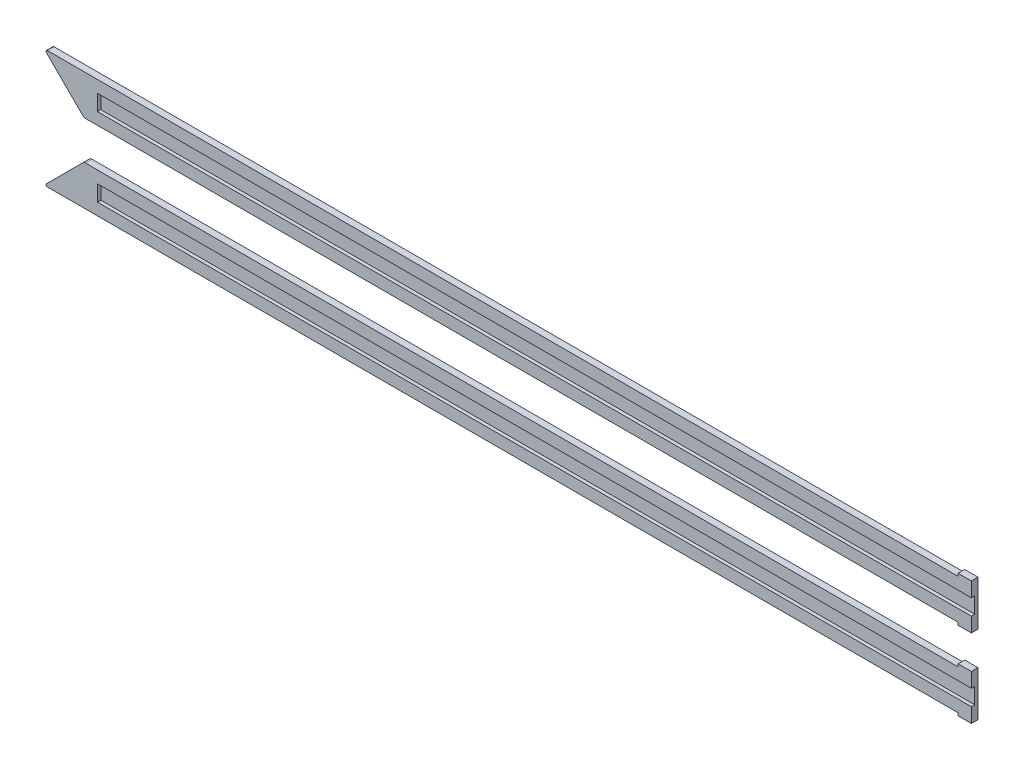
ISO-10303-21;
HEADER;
FILE_DESCRIPTION(('STEP AP214'),'2;1');
FILE_NAME('part.step','',(''),(''),'','','');
FILE_SCHEMA(('AUTOMOTIVE_DESIGN { 1 0 10303 214 1 1 1 1 }'));
ENDSEC;
DATA;
#1=APPLICATION_CONTEXT('core data for automotive mechanical design processes');
#2=APPLICATION_PROTOCOL_DEFINITION('international standard','automotive_design',2000,#1);
#3=PRODUCT_CONTEXT('',#1,'mechanical');
#4=PRODUCT('Part','Part','',(#3));
#5=PRODUCT_RELATED_PRODUCT_CATEGORY('part','',(#4));
#6=PRODUCT_DEFINITION_FORMATION('','',#4);
#7=PRODUCT_DEFINITION_CONTEXT('part definition',#1,'design');
#8=PRODUCT_DEFINITION('design','',#6,#7);
#9=PRODUCT_DEFINITION_SHAPE('','',#8);
#10=(LENGTH_UNIT() NAMED_UNIT(*) SI_UNIT(.MILLI.,.METRE.));
#11=(NAMED_UNIT(*) PLANE_ANGLE_UNIT() SI_UNIT($,.RADIAN.));
#12=(NAMED_UNIT(*) SI_UNIT($,.STERADIAN.) SOLID_ANGLE_UNIT());
#13=UNCERTAINTY_MEASURE_WITH_UNIT(LENGTH_MEASURE(1.E-05),#10,'distance_accuracy_value','');
#14=(GEOMETRIC_REPRESENTATION_CONTEXT(3) GLOBAL_UNCERTAINTY_ASSIGNED_CONTEXT((#13)) GLOBAL_UNIT_ASSIGNED_CONTEXT((#10,
#11,#12)) REPRESENTATION_CONTEXT('',''));
#15=CARTESIAN_POINT('',(0.,0.,0.));
#16=DIRECTION('',(0.,0.,1.));
#17=DIRECTION('',(1.,0.,0.));
#18=AXIS2_PLACEMENT_3D('',#15,#16,#17);
#19=CARTESIAN_POINT('',(-51.6538112143152,-14.5806012237701,5.));
#20=DIRECTION('',(0.,-1.,0.));
#21=DIRECTION('',(-1.,0.,0.));
#22=AXIS2_PLACEMENT_3D('',#19,#20,#21);
#23=PLANE('',#22);
#24=DIRECTION('',(0.,0.,-1.));
#25=VECTOR('',#24,1.);
#26=CARTESIAN_POINT('',(606.848948473299,-14.5806012237701,5.));
#27=LINE('',#26,#25);
#28=CARTESIAN_POINT('',(606.848948473299,-14.5806012237701,5.));
#29=VERTEX_POINT('',#28);
#30=CARTESIAN_POINT('',(606.848948473299,-14.5806012237701,0.));
#31=VERTEX_POINT('',#30);
#32=EDGE_CURVE('E101',#29,#31,#27,.T.);
#33=ORIENTED_EDGE('',*,*,#32,.T.);
#34=DIRECTION('',(1.,0.,0.));
#35=VECTOR('',#34,1.);
#36=CARTESIAN_POINT('',(-51.6538112143152,-14.5806012237701,0.));
#37=LINE('',#36,#35);
#38=CARTESIAN_POINT('',(-51.6538112143152,-14.5806012237701,0.));
#39=VERTEX_POINT('',#38);
#40=EDGE_CURVE('E255',#39,#31,#37,.T.);
#41=ORIENTED_EDGE('',*,*,#40,.F.);
#42=DIRECTION('',(0.,0.,-1.));
#43=VECTOR('',#42,1.);
#44=CARTESIAN_POINT('',(-51.6538112143152,-14.5806012237701,5.));
#45=LINE('',#44,#43);
#46=CARTESIAN_POINT('',(-51.6538112143152,-14.5806012237701,5.));
#47=VERTEX_POINT('',#46);
#48=EDGE_CURVE('E187',#47,#39,#45,.T.);
#49=ORIENTED_EDGE('',*,*,#48,.F.);
#50=DIRECTION('',(1.,0.,0.));
#51=VECTOR('',#50,1.);
#52=CARTESIAN_POINT('',(-51.6538112143152,-14.5806012237701,5.));
#53=LINE('',#52,#51);
#54=EDGE_CURVE('E275',#47,#29,#53,.T.);
#55=ORIENTED_EDGE('',*,*,#54,.T.);
#56=EDGE_LOOP('',(#33,#41,#49,#55));
#57=FACE_BOUND('',#56,.T.);
#58=ADVANCED_FACE('F92',(#57),#23,.F.);
#59=CARTESIAN_POINT('',(616.848948473299,-44.5806012237701,5.));
#60=DIRECTION('',(1.,0.,0.));
#61=DIRECTION('',(0.,0.,-1.));
#62=AXIS2_PLACEMENT_3D('',#59,#60,#61);
#63=PLANE('',#62);
#64=DIRECTION('',(0.,0.,-1.));
#65=VECTOR('',#64,1.);
#66=CARTESIAN_POINT('',(616.848948473299,-23.5806012237701,5.));
#67=LINE('',#66,#65);
#68=CARTESIAN_POINT('',(616.848948473299,-23.5806012237701,5.));
#69=VERTEX_POINT('',#68);
#70=CARTESIAN_POINT('',(616.848948473299,-23.5806012237701,2.5));
#71=VERTEX_POINT('',#70);
#72=EDGE_CURVE('E176',#69,#71,#67,.T.);
#73=ORIENTED_EDGE('',*,*,#72,.T.);
#74=DIRECTION('',(0.,-1.,0.));
#75=VECTOR('',#74,1.);
#76=CARTESIAN_POINT('',(616.848948473299,-44.5806012237701,2.5));
#77=LINE('',#76,#75);
#78=CARTESIAN_POINT('',(616.848948473299,-35.5806012237701,2.5));
#79=VERTEX_POINT('',#78);
#80=EDGE_CURVE('E15',#71,#79,#77,.T.);
#81=ORIENTED_EDGE('',*,*,#80,.T.);
#82=DIRECTION('',(0.,0.,-1.));
#83=VECTOR('',#82,1.);
#84=CARTESIAN_POINT('',(616.848948473299,-35.5806012237701,5.));
#85=LINE('',#84,#83);
#86=CARTESIAN_POINT('',(616.848948473299,-35.5806012237701,5.));
#87=VERTEX_POINT('',#86);
#88=EDGE_CURVE('E181',#87,#79,#85,.T.);
#89=ORIENTED_EDGE('',*,*,#88,.F.);
#90=DIRECTION('',(0.,1.,0.));
#91=VECTOR('',#90,1.);
#92=CARTESIAN_POINT('',(616.848948473299,-44.5806012237701,5.));
#93=LINE('',#92,#91);
#94=CARTESIAN_POINT('',(616.848948473299,-46.5806012237701,5.));
#95=VERTEX_POINT('',#94);
#96=EDGE_CURVE('E271',#95,#87,#93,.T.);
#97=ORIENTED_EDGE('',*,*,#96,.F.);
#98=DIRECTION('',(0.,0.,-1.));
#99=VECTOR('',#98,1.);
#100=CARTESIAN_POINT('',(616.848948473299,-46.5806012237701,5.));
#101=LINE('',#100,#99);
#102=CARTESIAN_POINT('',(616.848948473299,-46.5806012237701,0.));
#103=VERTEX_POINT('',#102);
#104=EDGE_CURVE('E158',#95,#103,#101,.T.);
#105=ORIENTED_EDGE('',*,*,#104,.T.);
#106=DIRECTION('',(0.,1.,0.));
#107=VECTOR('',#106,1.);
#108=CARTESIAN_POINT('',(616.848948473299,-44.5806012237701,0.));
#109=LINE('',#108,#107);
#110=CARTESIAN_POINT('',(616.848948473299,-12.5806012237701,0.));
#111=VERTEX_POINT('',#110);
#112=EDGE_CURVE('E173',#103,#111,#109,.T.);
#113=ORIENTED_EDGE('',*,*,#112,.T.);
#114=DIRECTION('',(0.,0.,-1.));
#115=VECTOR('',#114,1.);
#116=CARTESIAN_POINT('',(616.848948473299,-12.5806012237701,5.));
#117=LINE('',#116,#115);
#118=CARTESIAN_POINT('',(616.848948473299,-12.5806012237701,5.));
#119=VERTEX_POINT('',#118);
#120=EDGE_CURVE('E202',#119,#111,#117,.T.);
#121=ORIENTED_EDGE('',*,*,#120,.F.);
#122=EDGE_CURVE('E274',#69,#119,#93,.T.);
#123=ORIENTED_EDGE('',*,*,#122,.F.);
#124=EDGE_LOOP('',(#73,#81,#89,#97,#105,#113,#121,#123));
#125=FACE_BOUND('',#124,.T.);
#126=ADVANCED_FACE('F330',(#125),#63,.T.);
#127=CARTESIAN_POINT('',(-80.4822383390613,-44.5806012237701,5.));
#128=DIRECTION('',(0.,-1.,0.));
#129=DIRECTION('',(-1.,0.,0.));
#130=AXIS2_PLACEMENT_3D('',#127,#128,#129);
#131=PLANE('',#130);
#132=DIRECTION('',(1.,0.,0.));
#133=VECTOR('',#132,1.);
#134=CARTESIAN_POINT('',(-80.4822383390613,-44.5806012237701,5.));
#135=LINE('',#134,#133);
#136=CARTESIAN_POINT('',(-80.4822383390613,-44.5806012237701,5.));
#137=VERTEX_POINT('',#136);
#138=CARTESIAN_POINT('',(606.848948473299,-44.5806012237701,5.));
#139=VERTEX_POINT('',#138);
#140=EDGE_CURVE('E268',#137,#139,#135,.T.);
#141=ORIENTED_EDGE('',*,*,#140,.F.);
#142=DIRECTION('',(0.,0.,-1.));
#143=VECTOR('',#142,1.);
#144=CARTESIAN_POINT('',(-80.4822383390613,-44.5806012237701,5.));
#145=LINE('',#144,#143);
#146=CARTESIAN_POINT('',(-80.4822383390613,-44.5806012237701,0.));
#147=VERTEX_POINT('',#146);
#148=EDGE_CURVE('E228',#137,#147,#145,.T.);
#149=ORIENTED_EDGE('',*,*,#148,.T.);
#150=DIRECTION('',(1.,0.,0.));
#151=VECTOR('',#150,1.);
#152=CARTESIAN_POINT('',(-80.4822383390613,-44.5806012237701,0.));
#153=LINE('',#152,#151);
#154=CARTESIAN_POINT('',(606.848948473299,-44.5806012237701,0.));
#155=VERTEX_POINT('',#154);
#156=EDGE_CURVE('E250',#147,#155,#153,.T.);
#157=ORIENTED_EDGE('',*,*,#156,.T.);
#158=DIRECTION('',(0.,0.,-1.));
#159=VECTOR('',#158,1.);
#160=CARTESIAN_POINT('',(606.848948473299,-44.5806012237701,5.));
#161=LINE('',#160,#159);
#162=EDGE_CURVE('E164',#139,#155,#161,.T.);
#163=ORIENTED_EDGE('',*,*,#162,.F.);
#164=EDGE_LOOP('',(#141,#149,#157,#163));
#165=FACE_BOUND('',#164,.T.);
#166=ADVANCED_FACE('F414',(#165),#131,.T.);
#167=CARTESIAN_POINT('',(-80.4822383390613,-43.5806012237701,5.));
#168=DIRECTION('',(0.,0.,-1.));
#169=DIRECTION('',(-1.,0.,0.));
#170=AXIS2_PLACEMENT_3D('',#167,#168,#169);
#171=CYLINDRICAL_SURFACE('',#170,0.999999999999993);
#172=CARTESIAN_POINT('',(-80.4822383390613,-43.5806012237701,0.));
#173=DIRECTION('',(0.,0.,-1.));
#174=DIRECTION('',(1.,0.,0.));
#175=AXIS2_PLACEMENT_3D('',#172,#173,#174);
#176=CIRCLE('',#175,0.999999999999993);
#177=CARTESIAN_POINT('',(-81.1893451202479,-42.8734944425835,0.));
#178=VERTEX_POINT('',#177);
#179=EDGE_CURVE('E246',#147,#178,#176,.T.);
#180=ORIENTED_EDGE('',*,*,#179,.F.);
#181=ORIENTED_EDGE('',*,*,#148,.F.);
#182=CARTESIAN_POINT('',(-80.4822383390613,-43.5806012237701,5.));
#183=DIRECTION('',(0.,0.,-1.));
#184=DIRECTION('',(1.,0.,0.));
#185=AXIS2_PLACEMENT_3D('',#182,#183,#184);
#186=CIRCLE('',#185,0.999999999999993);
#187=CARTESIAN_POINT('',(-81.1893451202479,-42.8734944425835,5.));
#188=VERTEX_POINT('',#187);
#189=EDGE_CURVE('E264',#137,#188,#186,.T.);
#190=ORIENTED_EDGE('',*,*,#189,.T.);
#191=DIRECTION('',(0.,0.,-1.));
#192=VECTOR('',#191,1.);
#193=CARTESIAN_POINT('',(-81.1893451202479,-42.8734944425835,5.));
#194=LINE('',#193,#192);
#195=EDGE_CURVE('E232',#188,#178,#194,.T.);
#196=ORIENTED_EDGE('',*,*,#195,.T.);
#197=EDGE_LOOP('',(#180,#181,#190,#196));
#198=FACE_BOUND('',#197,.T.);
#199=ADVANCED_FACE('F411',(#198),#171,.T.);
#200=CARTESIAN_POINT('',(-81.1893451202479,-42.8734944425835,5.));
#201=DIRECTION('',(0.707106781186549,-0.707106781186546,0.));
#202=DIRECTION('',(-0.707106781186546,-0.707106781186549,0.));
#203=AXIS2_PLACEMENT_3D('',#200,#201,#202);
#204=PLANE('',#203);
#205=DIRECTION('',(0.707106781186546,0.707106781186549,0.));
#206=VECTOR('',#205,1.);
#207=CARTESIAN_POINT('',(-81.1893451202479,-42.8734944425835,0.));
#208=LINE('',#207,#206);
#209=CARTESIAN_POINT('',(-53.7751315578748,-15.4592808802104,0.));
#210=VERTEX_POINT('',#209);
#211=EDGE_CURVE('E241',#178,#210,#208,.T.);
#212=ORIENTED_EDGE('',*,*,#211,.F.);
#213=ORIENTED_EDGE('',*,*,#195,.F.);
#214=DIRECTION('',(0.707106781186546,0.707106781186549,0.));
#215=VECTOR('',#214,1.);
#216=CARTESIAN_POINT('',(-81.1893451202479,-42.8734944425835,5.));
#217=LINE('',#216,#215);
#218=CARTESIAN_POINT('',(-53.7751315578748,-15.4592808802104,5.));
#219=VERTEX_POINT('',#218);
#220=EDGE_CURVE('E240',#188,#219,#217,.T.);
#221=ORIENTED_EDGE('',*,*,#220,.T.);
#222=DIRECTION('',(0.,0.,-1.));
#223=VECTOR('',#222,1.);
#224=CARTESIAN_POINT('',(-53.7751315578748,-15.4592808802104,5.));
#225=LINE('',#224,#223);
#226=EDGE_CURVE('E236',#219,#210,#225,.T.);
#227=ORIENTED_EDGE('',*,*,#226,.T.);
#228=EDGE_LOOP('',(#212,#213,#221,#227));
#229=FACE_BOUND('',#228,.T.);
#230=ADVANCED_FACE('F408',(#229),#204,.F.);
#231=CARTESIAN_POINT('',(-51.6538112143152,-17.5806012237701,5.));
#232=DIRECTION('',(0.,0.,-1.));
#233=DIRECTION('',(-1.,0.,0.));
#234=AXIS2_PLACEMENT_3D('',#231,#232,#233);
#235=CYLINDRICAL_SURFACE('',#234,3.);
#236=CARTESIAN_POINT('',(-51.6538112143152,-17.5806012237701,0.));
#237=DIRECTION('',(0.,0.,-1.));
#238=DIRECTION('',(1.,0.,0.));
#239=AXIS2_PLACEMENT_3D('',#236,#237,#238);
#240=CIRCLE('',#239,3.);
#241=EDGE_CURVE('E207',#210,#39,#240,.T.);
#242=ORIENTED_EDGE('',*,*,#241,.F.);
#243=ORIENTED_EDGE('',*,*,#226,.F.);
#244=CARTESIAN_POINT('',(-51.6538112143152,-17.5806012237701,5.));
#245=DIRECTION('',(0.,0.,-1.));
#246=DIRECTION('',(1.,0.,0.));
#247=AXIS2_PLACEMENT_3D('',#244,#245,#246);
#248=CIRCLE('',#247,3.);
#249=EDGE_CURVE('E245',#219,#47,#248,.T.);
#250=ORIENTED_EDGE('',*,*,#249,.T.);
#251=ORIENTED_EDGE('',*,*,#48,.T.);
#252=EDGE_LOOP('',(#242,#243,#250,#251));
#253=FACE_BOUND('',#252,.T.);
#254=ADVANCED_FACE('F406',(#253),#235,.T.);
#255=CARTESIAN_POINT('',(-51.6538112143152,-17.5806012237701,0.));
#256=DIRECTION('',(0.,0.,1.));
#257=DIRECTION('',(1.,0.,0.));
#258=AXIS2_PLACEMENT_3D('',#255,#256,#257);
#259=PLANE('',#258);
#260=ORIENTED_EDGE('',*,*,#241,.T.);
#261=ORIENTED_EDGE('',*,*,#40,.T.);
#262=DIRECTION('',(0.,1.,0.));
#263=VECTOR('',#262,1.);
#264=CARTESIAN_POINT('',(606.848948473299,-14.5806012237701,0.));
#265=LINE('',#264,#263);
#266=CARTESIAN_POINT('',(606.848948473299,-12.5806012237701,0.));
#267=VERTEX_POINT('',#266);
#268=EDGE_CURVE('E208',#31,#267,#265,.T.);
#269=ORIENTED_EDGE('',*,*,#268,.T.);
#270=DIRECTION('',(-1.,0.,0.));
#271=VECTOR('',#270,1.);
#272=CARTESIAN_POINT('',(616.848948473299,-12.5806012237701,0.));
#273=LINE('',#272,#271);
#274=EDGE_CURVE('E157',#111,#267,#273,.T.);
#275=ORIENTED_EDGE('',*,*,#274,.F.);
#276=ORIENTED_EDGE('',*,*,#112,.F.);
#277=DIRECTION('',(1.,0.,0.));
#278=VECTOR('',#277,1.);
#279=CARTESIAN_POINT('',(606.848948473299,-46.5806012237701,0.));
#280=LINE('',#279,#278);
#281=CARTESIAN_POINT('',(606.848948473299,-46.5806012237701,0.));
#282=VERTEX_POINT('',#281);
#283=EDGE_CURVE('E153',#282,#103,#280,.T.);
#284=ORIENTED_EDGE('',*,*,#283,.F.);
#285=DIRECTION('',(0.,-1.,0.));
#286=VECTOR('',#285,1.);
#287=CARTESIAN_POINT('',(606.848948473299,-44.5806012237701,0.));
#288=LINE('',#287,#286);
#289=EDGE_CURVE('E161',#155,#282,#288,.T.);
#290=ORIENTED_EDGE('',*,*,#289,.F.);
#291=ORIENTED_EDGE('',*,*,#156,.F.);
#292=ORIENTED_EDGE('',*,*,#179,.T.);
#293=ORIENTED_EDGE('',*,*,#211,.T.);
#294=EDGE_LOOP('',(#260,#261,#269,#275,#276,#284,#290,#291,#292,#293));
#295=FACE_BOUND('',#294,.T.);
#296=ADVANCED_FACE('F171',(#295),#259,.F.);
#297=CARTESIAN_POINT('',(-51.6538112143152,-17.5806012237701,5.));
#298=DIRECTION('',(0.,0.,1.));
#299=DIRECTION('',(1.,0.,0.));
#300=AXIS2_PLACEMENT_3D('',#297,#298,#299);
#301=PLANE('',#300);
#302=DIRECTION('',(1.,0.,0.));
#303=VECTOR('',#302,1.);
#304=CARTESIAN_POINT('',(-42.6194102172182,-23.5806012237701,5.));
#305=LINE('',#304,#303);
#306=CARTESIAN_POINT('',(-42.6194102172182,-23.5806012237701,5.));
#307=VERTEX_POINT('',#306);
#308=EDGE_CURVE('E299',#307,#69,#305,.T.);
#309=ORIENTED_EDGE('',*,*,#308,.T.);
#310=ORIENTED_EDGE('',*,*,#122,.T.);
#311=DIRECTION('',(-1.,0.,0.));
#312=VECTOR('',#311,1.);
#313=CARTESIAN_POINT('',(616.848948473299,-12.5806012237701,5.));
#314=LINE('',#313,#312);
#315=CARTESIAN_POINT('',(606.848948473299,-12.5806012237701,5.));
#316=VERTEX_POINT('',#315);
#317=EDGE_CURVE('E212',#119,#316,#314,.T.);
#318=ORIENTED_EDGE('',*,*,#317,.T.);
#319=DIRECTION('',(0.,1.,0.));
#320=VECTOR('',#319,1.);
#321=CARTESIAN_POINT('',(606.848948473299,-14.5806012237701,5.));
#322=LINE('',#321,#320);
#323=EDGE_CURVE('E203',#29,#316,#322,.T.);
#324=ORIENTED_EDGE('',*,*,#323,.F.);
#325=ORIENTED_EDGE('',*,*,#54,.F.);
#326=ORIENTED_EDGE('',*,*,#249,.F.);
#327=ORIENTED_EDGE('',*,*,#220,.F.);
#328=ORIENTED_EDGE('',*,*,#189,.F.);
#329=ORIENTED_EDGE('',*,*,#140,.T.);
#330=DIRECTION('',(0.,-1.,0.));
#331=VECTOR('',#330,1.);
#332=CARTESIAN_POINT('',(606.848948473299,-44.5806012237701,5.));
#333=LINE('',#332,#331);
#334=CARTESIAN_POINT('',(606.848948473299,-46.5806012237701,5.));
#335=VERTEX_POINT('',#334);
#336=EDGE_CURVE('E117',#139,#335,#333,.T.);
#337=ORIENTED_EDGE('',*,*,#336,.T.);
#338=DIRECTION('',(1.,0.,0.));
#339=VECTOR('',#338,1.);
#340=CARTESIAN_POINT('',(606.848948473299,-46.5806012237701,5.));
#341=LINE('',#340,#339);
#342=EDGE_CURVE('E155',#335,#95,#341,.T.);
#343=ORIENTED_EDGE('',*,*,#342,.T.);
#344=ORIENTED_EDGE('',*,*,#96,.T.);
#345=DIRECTION('',(1.,0.,0.));
#346=VECTOR('',#345,1.);
#347=CARTESIAN_POINT('',(-42.6194102172182,-35.5806012237701,5.));
#348=LINE('',#347,#346);
#349=CARTESIAN_POINT('',(-42.6194102172182,-35.5806012237701,5.));
#350=VERTEX_POINT('',#349);
#351=EDGE_CURVE('E108',#350,#87,#348,.T.);
#352=ORIENTED_EDGE('',*,*,#351,.F.);
#353=DIRECTION('',(0.,1.,0.));
#354=VECTOR('',#353,1.);
#355=CARTESIAN_POINT('',(-42.6194102172182,-35.5806012237701,5.));
#356=LINE('',#355,#354);
#357=EDGE_CURVE('E292',#350,#307,#356,.T.);
#358=ORIENTED_EDGE('',*,*,#357,.T.);
#359=EDGE_LOOP('',(#309,#310,#318,#324,#325,#326,#327,#328,#329,#337,#343,#344,#352,#358));
#360=FACE_BOUND('',#359,.T.);
#361=ADVANCED_FACE('F362',(#360),#301,.T.);
#362=CARTESIAN_POINT('',(606.848948473299,-44.5806012237701,5.));
#363=DIRECTION('',(-1.,0.,0.));
#364=DIRECTION('',(0.,0.,1.));
#365=AXIS2_PLACEMENT_3D('',#362,#363,#364);
#366=PLANE('',#365);
#367=ORIENTED_EDGE('',*,*,#289,.T.);
#368=DIRECTION('',(0.,0.,-1.));
#369=VECTOR('',#368,1.);
#370=CARTESIAN_POINT('',(606.848948473299,-46.5806012237701,5.));
#371=LINE('',#370,#369);
#372=EDGE_CURVE('E149',#335,#282,#371,.T.);
#373=ORIENTED_EDGE('',*,*,#372,.F.);
#374=ORIENTED_EDGE('',*,*,#336,.F.);
#375=ORIENTED_EDGE('',*,*,#162,.T.);
#376=EDGE_LOOP('',(#367,#373,#374,#375));
#377=FACE_BOUND('',#376,.T.);
#378=ADVANCED_FACE('F162',(#377),#366,.T.);
#379=CARTESIAN_POINT('',(606.848948473299,-46.5806012237701,5.));
#380=DIRECTION('',(0.,-1.,0.));
#381=DIRECTION('',(0.,0.,1.));
#382=AXIS2_PLACEMENT_3D('',#379,#380,#381);
#383=PLANE('',#382);
#384=ORIENTED_EDGE('',*,*,#283,.T.);
#385=ORIENTED_EDGE('',*,*,#104,.F.);
#386=ORIENTED_EDGE('',*,*,#342,.F.);
#387=ORIENTED_EDGE('',*,*,#372,.T.);
#388=EDGE_LOOP('',(#384,#385,#386,#387));
#389=FACE_BOUND('',#388,.T.);
#390=ADVANCED_FACE('F94',(#389),#383,.T.);
#391=CARTESIAN_POINT('',(606.848948473299,-14.5806012237701,5.));
#392=DIRECTION('',(1.,0.,0.));
#393=DIRECTION('',(0.,0.,-1.));
#394=AXIS2_PLACEMENT_3D('',#391,#392,#393);
#395=PLANE('',#394);
#396=ORIENTED_EDGE('',*,*,#268,.F.);
#397=ORIENTED_EDGE('',*,*,#32,.F.);
#398=ORIENTED_EDGE('',*,*,#323,.T.);
#399=DIRECTION('',(0.,0.,-1.));
#400=VECTOR('',#399,1.);
#401=CARTESIAN_POINT('',(606.848948473299,-12.5806012237701,5.));
#402=LINE('',#401,#400);
#403=EDGE_CURVE('E199',#316,#267,#402,.T.);
#404=ORIENTED_EDGE('',*,*,#403,.T.);
#405=EDGE_LOOP('',(#396,#397,#398,#404));
#406=FACE_BOUND('',#405,.T.);
#407=ADVANCED_FACE('F398',(#406),#395,.F.);
#408=CARTESIAN_POINT('',(616.848948473299,-12.5806012237701,5.));
#409=DIRECTION('',(0.,1.,0.));
#410=DIRECTION('',(1.,0.,0.));
#411=AXIS2_PLACEMENT_3D('',#408,#409,#410);
#412=PLANE('',#411);
#413=ORIENTED_EDGE('',*,*,#274,.T.);
#414=ORIENTED_EDGE('',*,*,#403,.F.);
#415=ORIENTED_EDGE('',*,*,#317,.F.);
#416=ORIENTED_EDGE('',*,*,#120,.T.);
#417=EDGE_LOOP('',(#413,#414,#415,#416));
#418=FACE_BOUND('',#417,.T.);
#419=ADVANCED_FACE('F432',(#418),#412,.T.);
#420=CARTESIAN_POINT('',(-42.6194102172182,-23.5806012237701,2.5));
#421=DIRECTION('',(0.,1.,0.));
#422=DIRECTION('',(0.,0.,-1.));
#423=AXIS2_PLACEMENT_3D('',#420,#421,#422);
#424=PLANE('',#423);
#425=ORIENTED_EDGE('',*,*,#72,.F.);
#426=ORIENTED_EDGE('',*,*,#308,.F.);
#427=DIRECTION('',(0.,0.,1.));
#428=VECTOR('',#427,1.);
#429=CARTESIAN_POINT('',(-42.6194102172182,-23.5806012237701,2.5));
#430=LINE('',#429,#428);
#431=CARTESIAN_POINT('',(-42.6194102172182,-23.5806012237701,2.5));
#432=VERTEX_POINT('',#431);
#433=EDGE_CURVE('E284',#432,#307,#430,.T.);
#434=ORIENTED_EDGE('',*,*,#433,.F.);
#435=DIRECTION('',(1.,0.,0.));
#436=VECTOR('',#435,1.);
#437=CARTESIAN_POINT('',(-42.6194102172182,-23.5806012237701,2.5));
#438=LINE('',#437,#436);
#439=EDGE_CURVE('E296',#432,#71,#438,.T.);
#440=ORIENTED_EDGE('',*,*,#439,.T.);
#441=EDGE_LOOP('',(#425,#426,#434,#440));
#442=FACE_BOUND('',#441,.T.);
#443=ADVANCED_FACE('F318',(#442),#424,.F.);
#444=CARTESIAN_POINT('',(-42.6194102172182,-35.5806012237701,2.5));
#445=DIRECTION('',(-1.,0.,0.));
#446=DIRECTION('',(0.,0.,1.));
#447=AXIS2_PLACEMENT_3D('',#444,#445,#446);
#448=PLANE('',#447);
#449=ORIENTED_EDGE('',*,*,#357,.F.);
#450=DIRECTION('',(0.,0.,1.));
#451=VECTOR('',#450,1.);
#452=CARTESIAN_POINT('',(-42.6194102172182,-35.5806012237701,2.5));
#453=LINE('',#452,#451);
#454=CARTESIAN_POINT('',(-42.6194102172182,-35.5806012237701,2.5));
#455=VERTEX_POINT('',#454);
#456=EDGE_CURVE('E285',#455,#350,#453,.T.);
#457=ORIENTED_EDGE('',*,*,#456,.F.);
#458=DIRECTION('',(0.,1.,0.));
#459=VECTOR('',#458,1.);
#460=CARTESIAN_POINT('',(-42.6194102172182,-35.5806012237701,2.5));
#461=LINE('',#460,#459);
#462=EDGE_CURVE('E288',#455,#432,#461,.T.);
#463=ORIENTED_EDGE('',*,*,#462,.T.);
#464=ORIENTED_EDGE('',*,*,#433,.T.);
#465=EDGE_LOOP('',(#449,#457,#463,#464));
#466=FACE_BOUND('',#465,.T.);
#467=ADVANCED_FACE('F496',(#466),#448,.F.);
#468=CARTESIAN_POINT('',(-42.6194102172182,-35.5806012237701,2.5));
#469=DIRECTION('',(0.,1.,0.));
#470=DIRECTION('',(0.,0.,-1.));
#471=AXIS2_PLACEMENT_3D('',#468,#469,#470);
#472=PLANE('',#471);
#473=ORIENTED_EDGE('',*,*,#351,.T.);
#474=ORIENTED_EDGE('',*,*,#88,.T.);
#475=DIRECTION('',(1.,0.,0.));
#476=VECTOR('',#475,1.);
#477=CARTESIAN_POINT('',(-42.6194102172182,-35.5806012237701,2.5));
#478=LINE('',#477,#476);
#479=EDGE_CURVE('E306',#455,#79,#478,.T.);
#480=ORIENTED_EDGE('',*,*,#479,.F.);
#481=ORIENTED_EDGE('',*,*,#456,.T.);
#482=EDGE_LOOP('',(#473,#474,#480,#481));
#483=FACE_BOUND('',#482,.T.);
#484=ADVANCED_FACE('F504',(#483),#472,.T.);
#485=CARTESIAN_POINT('',(0.,0.,2.5));
#486=DIRECTION('',(0.,0.,-1.));
#487=DIRECTION('',(-1.,0.,0.));
#488=AXIS2_PLACEMENT_3D('',#485,#486,#487);
#489=PLANE('',#488);
#490=ORIENTED_EDGE('',*,*,#80,.F.);
#491=ORIENTED_EDGE('',*,*,#439,.F.);
#492=ORIENTED_EDGE('',*,*,#462,.F.);
#493=ORIENTED_EDGE('',*,*,#479,.T.);
#494=EDGE_LOOP('',(#490,#491,#492,#493));
#495=FACE_BOUND('',#494,.T.);
#496=ADVANCED_FACE('F325',(#495),#489,.F.);
#497=CLOSED_SHELL('',(#58,#126,#166,#199,#230,#254,#296,#361,#378,#390,#407,#419,#443,#467,#484,#496));
#498=MANIFOLD_SOLID_BREP('B2',#497);
#499=CARTESIAN_POINT('',(-51.6538112143152,14.5806012237701,5.));
#500=DIRECTION('',(0.,1.,0.));
#501=DIRECTION('',(-1.,0.,0.));
#502=AXIS2_PLACEMENT_3D('',#499,#500,#501);
#503=PLANE('',#502);
#504=DIRECTION('',(0.,0.,-1.));
#505=VECTOR('',#504,1.);
#506=CARTESIAN_POINT('',(606.848948473299,14.5806012237701,5.));
#507=LINE('',#506,#505);
#508=CARTESIAN_POINT('',(606.848948473299,14.5806012237701,5.));
#509=VERTEX_POINT('',#508);
#510=CARTESIAN_POINT('',(606.848948473299,14.5806012237701,0.));
#511=VERTEX_POINT('',#510);
#512=EDGE_CURVE('E611',#509,#511,#507,.T.);
#513=ORIENTED_EDGE('',*,*,#512,.F.);
#514=DIRECTION('',(1.,0.,0.));
#515=VECTOR('',#514,1.);
#516=CARTESIAN_POINT('',(-51.6538112143152,14.5806012237701,5.));
#517=LINE('',#516,#515);
#518=CARTESIAN_POINT('',(-51.6538112143152,14.5806012237701,5.));
#519=VERTEX_POINT('',#518);
#520=EDGE_CURVE('E779',#519,#509,#517,.T.);
#521=ORIENTED_EDGE('',*,*,#520,.F.);
#522=DIRECTION('',(0.,0.,-1.));
#523=VECTOR('',#522,1.);
#524=CARTESIAN_POINT('',(-51.6538112143152,14.5806012237701,5.));
#525=LINE('',#524,#523);
#526=CARTESIAN_POINT('',(-51.6538112143152,14.5806012237701,0.));
#527=VERTEX_POINT('',#526);
#528=EDGE_CURVE('E695',#519,#527,#525,.T.);
#529=ORIENTED_EDGE('',*,*,#528,.T.);
#530=DIRECTION('',(1.,0.,0.));
#531=VECTOR('',#530,1.);
#532=CARTESIAN_POINT('',(-51.6538112143152,14.5806012237701,0.));
#533=LINE('',#532,#531);
#534=EDGE_CURVE('E756',#527,#511,#533,.T.);
#535=ORIENTED_EDGE('',*,*,#534,.T.);
#536=EDGE_LOOP('',(#513,#521,#529,#535));
#537=FACE_BOUND('',#536,.T.);
#538=ADVANCED_FACE('F602',(#537),#503,.F.);
#539=CARTESIAN_POINT('',(616.848948473299,44.5806012237701,5.));
#540=DIRECTION('',(1.,0.,0.));
#541=DIRECTION('',(0.,0.,-1.));
#542=AXIS2_PLACEMENT_3D('',#539,#540,#541);
#543=PLANE('',#542);
#544=DIRECTION('',(0.,0.,-1.));
#545=VECTOR('',#544,1.);
#546=CARTESIAN_POINT('',(616.848948473299,23.5806012237701,5.));
#547=LINE('',#546,#545);
#548=CARTESIAN_POINT('',(616.848948473299,23.5806012237701,5.));
#549=VERTEX_POINT('',#548);
#550=CARTESIAN_POINT('',(616.848948473299,23.5806012237701,2.5));
#551=VERTEX_POINT('',#550);
#552=EDGE_CURVE('E679',#549,#551,#547,.T.);
#553=ORIENTED_EDGE('',*,*,#552,.F.);
#554=DIRECTION('',(0.,-1.,0.));
#555=VECTOR('',#554,1.);
#556=CARTESIAN_POINT('',(616.848948473299,44.5806012237701,5.));
#557=LINE('',#556,#555);
#558=CARTESIAN_POINT('',(616.848948473299,12.5806012237701,5.));
#559=VERTEX_POINT('',#558);
#560=EDGE_CURVE('E778',#549,#559,#557,.T.);
#561=ORIENTED_EDGE('',*,*,#560,.T.);
#562=DIRECTION('',(0.,0.,-1.));
#563=VECTOR('',#562,1.);
#564=CARTESIAN_POINT('',(616.848948473299,12.5806012237701,5.));
#565=LINE('',#564,#563);
#566=CARTESIAN_POINT('',(616.848948473299,12.5806012237701,0.));
#567=VERTEX_POINT('',#566);
#568=EDGE_CURVE('E704',#559,#567,#565,.T.);
#569=ORIENTED_EDGE('',*,*,#568,.T.);
#570=DIRECTION('',(0.,-1.,0.));
#571=VECTOR('',#570,1.);
#572=CARTESIAN_POINT('',(616.848948473299,44.5806012237701,0.));
#573=LINE('',#572,#571);
#574=CARTESIAN_POINT('',(616.848948473299,46.5806012237701,0.));
#575=VERTEX_POINT('',#574);
#576=EDGE_CURVE('E753',#575,#567,#573,.T.);
#577=ORIENTED_EDGE('',*,*,#576,.F.);
#578=DIRECTION('',(0.,0.,-1.));
#579=VECTOR('',#578,1.);
#580=CARTESIAN_POINT('',(616.848948473299,46.5806012237701,5.));
#581=LINE('',#580,#579);
#582=CARTESIAN_POINT('',(616.848948473299,46.5806012237701,5.));
#583=VERTEX_POINT('',#582);
#584=EDGE_CURVE('E671',#583,#575,#581,.T.);
#585=ORIENTED_EDGE('',*,*,#584,.F.);
#586=CARTESIAN_POINT('',(616.848948473299,35.5806012237701,5.));
#587=VERTEX_POINT('',#586);
#588=EDGE_CURVE('E774',#583,#587,#557,.T.);
#589=ORIENTED_EDGE('',*,*,#588,.T.);
#590=DIRECTION('',(0.,0.,-1.));
#591=VECTOR('',#590,1.);
#592=CARTESIAN_POINT('',(616.848948473299,35.5806012237701,5.));
#593=LINE('',#592,#591);
#594=CARTESIAN_POINT('',(616.848948473299,35.5806012237701,2.5));
#595=VERTEX_POINT('',#594);
#596=EDGE_CURVE('E618',#587,#595,#593,.T.);
#597=ORIENTED_EDGE('',*,*,#596,.T.);
#598=DIRECTION('',(0.,1.,0.));
#599=VECTOR('',#598,1.);
#600=CARTESIAN_POINT('',(616.848948473299,44.5806012237701,2.5));
#601=LINE('',#600,#599);
#602=EDGE_CURVE('E90',#551,#595,#601,.T.);
#603=ORIENTED_EDGE('',*,*,#602,.F.);
#604=EDGE_LOOP('',(#553,#561,#569,#577,#585,#589,#597,#603));
#605=FACE_BOUND('',#604,.T.);
#606=ADVANCED_FACE('F834',(#605),#543,.T.);
#607=CARTESIAN_POINT('',(-80.4822383390613,44.5806012237701,5.));
#608=DIRECTION('',(0.,1.,0.));
#609=DIRECTION('',(-1.,0.,0.));
#610=AXIS2_PLACEMENT_3D('',#607,#608,#609);
#611=PLANE('',#610);
#612=DIRECTION('',(1.,0.,0.));
#613=VECTOR('',#612,1.);
#614=CARTESIAN_POINT('',(-80.4822383390613,44.5806012237701,5.));
#615=LINE('',#614,#613);
#616=CARTESIAN_POINT('',(-80.4822383390613,44.5806012237701,5.));
#617=VERTEX_POINT('',#616);
#618=CARTESIAN_POINT('',(606.848948473299,44.5806012237701,5.));
#619=VERTEX_POINT('',#618);
#620=EDGE_CURVE('E770',#617,#619,#615,.T.);
#621=ORIENTED_EDGE('',*,*,#620,.T.);
#622=DIRECTION('',(0.,0.,-1.));
#623=VECTOR('',#622,1.);
#624=CARTESIAN_POINT('',(606.848948473299,44.5806012237701,5.));
#625=LINE('',#624,#623);
#626=CARTESIAN_POINT('',(606.848948473299,44.5806012237701,0.));
#627=VERTEX_POINT('',#626);
#628=EDGE_CURVE('E627',#619,#627,#625,.T.);
#629=ORIENTED_EDGE('',*,*,#628,.T.);
#630=DIRECTION('',(1.,0.,0.));
#631=VECTOR('',#630,1.);
#632=CARTESIAN_POINT('',(-80.4822383390613,44.5806012237701,0.));
#633=LINE('',#632,#631);
#634=CARTESIAN_POINT('',(-80.4822383390613,44.5806012237701,0.));
#635=VERTEX_POINT('',#634);
#636=EDGE_CURVE('E685',#635,#627,#633,.T.);
#637=ORIENTED_EDGE('',*,*,#636,.F.);
#638=DIRECTION('',(0.,0.,-1.));
#639=VECTOR('',#638,1.);
#640=CARTESIAN_POINT('',(-80.4822383390613,44.5806012237701,5.));
#641=LINE('',#640,#639);
#642=EDGE_CURVE('E729',#617,#635,#641,.T.);
#643=ORIENTED_EDGE('',*,*,#642,.F.);
#644=EDGE_LOOP('',(#621,#629,#637,#643));
#645=FACE_BOUND('',#644,.T.);
#646=ADVANCED_FACE('F885',(#645),#611,.T.);
#647=CARTESIAN_POINT('',(-80.4822383390613,43.5806012237701,5.));
#648=DIRECTION('',(0.,0.,-1.));
#649=DIRECTION('',(-1.,0.,0.));
#650=AXIS2_PLACEMENT_3D('',#647,#648,#649);
#651=CYLINDRICAL_SURFACE('',#650,0.999999999999993);
#652=CARTESIAN_POINT('',(-80.4822383390613,43.5806012237701,0.));
#653=DIRECTION('',(0.,0.,1.));
#654=DIRECTION('',(1.,0.,0.));
#655=AXIS2_PLACEMENT_3D('',#652,#653,#654);
#656=CIRCLE('',#655,0.999999999999993);
#657=CARTESIAN_POINT('',(-81.1893451202479,42.8734944425835,0.));
#658=VERTEX_POINT('',#657);
#659=EDGE_CURVE('E747',#635,#658,#656,.T.);
#660=ORIENTED_EDGE('',*,*,#659,.T.);
#661=DIRECTION('',(0.,0.,-1.));
#662=VECTOR('',#661,1.);
#663=CARTESIAN_POINT('',(-81.1893451202479,42.8734944425835,5.));
#664=LINE('',#663,#662);
#665=CARTESIAN_POINT('',(-81.1893451202479,42.8734944425835,5.));
#666=VERTEX_POINT('',#665);
#667=EDGE_CURVE('E733',#666,#658,#664,.T.);
#668=ORIENTED_EDGE('',*,*,#667,.F.);
#669=CARTESIAN_POINT('',(-80.4822383390613,43.5806012237701,5.));
#670=DIRECTION('',(0.,0.,1.));
#671=DIRECTION('',(1.,0.,0.));
#672=AXIS2_PLACEMENT_3D('',#669,#670,#671);
#673=CIRCLE('',#672,0.999999999999993);
#674=EDGE_CURVE('E766',#617,#666,#673,.T.);
#675=ORIENTED_EDGE('',*,*,#674,.F.);
#676=ORIENTED_EDGE('',*,*,#642,.T.);
#677=EDGE_LOOP('',(#660,#668,#675,#676));
#678=FACE_BOUND('',#677,.T.);
#679=ADVANCED_FACE('F882',(#678),#651,.T.);
#680=CARTESIAN_POINT('',(-81.1893451202479,42.8734944425835,5.));
#681=DIRECTION('',(0.707106781186549,0.707106781186546,0.));
#682=DIRECTION('',(-0.707106781186546,0.707106781186549,0.));
#683=AXIS2_PLACEMENT_3D('',#680,#681,#682);
#684=PLANE('',#683);
#685=DIRECTION('',(0.707106781186546,-0.707106781186549,0.));
#686=VECTOR('',#685,1.);
#687=CARTESIAN_POINT('',(-81.1893451202479,42.8734944425835,0.));
#688=LINE('',#687,#686);
#689=CARTESIAN_POINT('',(-53.7751315578748,15.4592808802104,0.));
#690=VERTEX_POINT('',#689);
#691=EDGE_CURVE('E742',#658,#690,#688,.T.);
#692=ORIENTED_EDGE('',*,*,#691,.T.);
#693=DIRECTION('',(0.,0.,-1.));
#694=VECTOR('',#693,1.);
#695=CARTESIAN_POINT('',(-53.7751315578748,15.4592808802104,5.));
#696=LINE('',#695,#694);
#697=CARTESIAN_POINT('',(-53.7751315578748,15.4592808802104,5.));
#698=VERTEX_POINT('',#697);
#699=EDGE_CURVE('E737',#698,#690,#696,.T.);
#700=ORIENTED_EDGE('',*,*,#699,.F.);
#701=DIRECTION('',(0.707106781186546,-0.707106781186549,0.));
#702=VECTOR('',#701,1.);
#703=CARTESIAN_POINT('',(-81.1893451202479,42.8734944425835,5.));
#704=LINE('',#703,#702);
#705=EDGE_CURVE('E741',#666,#698,#704,.T.);
#706=ORIENTED_EDGE('',*,*,#705,.F.);
#707=ORIENTED_EDGE('',*,*,#667,.T.);
#708=EDGE_LOOP('',(#692,#700,#706,#707));
#709=FACE_BOUND('',#708,.T.);
#710=ADVANCED_FACE('F877',(#709),#684,.F.);
#711=CARTESIAN_POINT('',(-51.6538112143152,17.5806012237701,5.));
#712=DIRECTION('',(0.,0.,-1.));
#713=DIRECTION('',(-1.,0.,0.));
#714=AXIS2_PLACEMENT_3D('',#711,#712,#713);
#715=CYLINDRICAL_SURFACE('',#714,3.);
#716=CARTESIAN_POINT('',(-51.6538112143152,17.5806012237701,0.));
#717=DIRECTION('',(0.,0.,1.));
#718=DIRECTION('',(1.,0.,0.));
#719=AXIS2_PLACEMENT_3D('',#716,#717,#718);
#720=CIRCLE('',#719,3.);
#721=EDGE_CURVE('E709',#690,#527,#720,.T.);
#722=ORIENTED_EDGE('',*,*,#721,.T.);
#723=ORIENTED_EDGE('',*,*,#528,.F.);
#724=CARTESIAN_POINT('',(-51.6538112143152,17.5806012237701,5.));
#725=DIRECTION('',(0.,0.,1.));
#726=DIRECTION('',(1.,0.,0.));
#727=AXIS2_PLACEMENT_3D('',#724,#725,#726);
#728=CIRCLE('',#727,3.);
#729=EDGE_CURVE('E746',#698,#519,#728,.T.);
#730=ORIENTED_EDGE('',*,*,#729,.F.);
#731=ORIENTED_EDGE('',*,*,#699,.T.);
#732=EDGE_LOOP('',(#722,#723,#730,#731));
#733=FACE_BOUND('',#732,.T.);
#734=ADVANCED_FACE('F873',(#733),#715,.T.);
#735=CARTESIAN_POINT('',(-51.6538112143152,17.5806012237701,0.));
#736=DIRECTION('',(0.,0.,1.));
#737=DIRECTION('',(1.,0.,0.));
#738=AXIS2_PLACEMENT_3D('',#735,#736,#737);
#739=PLANE('',#738);
#740=ORIENTED_EDGE('',*,*,#721,.F.);
#741=ORIENTED_EDGE('',*,*,#691,.F.);
#742=ORIENTED_EDGE('',*,*,#659,.F.);
#743=ORIENTED_EDGE('',*,*,#636,.T.);
#744=DIRECTION('',(0.,1.,0.));
#745=VECTOR('',#744,1.);
#746=CARTESIAN_POINT('',(606.848948473299,44.5806012237701,0.));
#747=LINE('',#746,#745);
#748=CARTESIAN_POINT('',(606.848948473299,46.5806012237701,0.));
#749=VERTEX_POINT('',#748);
#750=EDGE_CURVE('E663',#627,#749,#747,.T.);
#751=ORIENTED_EDGE('',*,*,#750,.T.);
#752=DIRECTION('',(1.,0.,0.));
#753=VECTOR('',#752,1.);
#754=CARTESIAN_POINT('',(606.848948473299,46.5806012237701,0.));
#755=LINE('',#754,#753);
#756=EDGE_CURVE('E675',#749,#575,#755,.T.);
#757=ORIENTED_EDGE('',*,*,#756,.T.);
#758=ORIENTED_EDGE('',*,*,#576,.T.);
#759=DIRECTION('',(-1.,0.,0.));
#760=VECTOR('',#759,1.);
#761=CARTESIAN_POINT('',(616.848948473299,12.5806012237701,0.));
#762=LINE('',#761,#760);
#763=CARTESIAN_POINT('',(606.848948473299,12.5806012237701,0.));
#764=VERTEX_POINT('',#763);
#765=EDGE_CURVE('E670',#567,#764,#762,.T.);
#766=ORIENTED_EDGE('',*,*,#765,.T.);
#767=DIRECTION('',(0.,-1.,0.));
#768=VECTOR('',#767,1.);
#769=CARTESIAN_POINT('',(606.848948473299,14.5806012237701,0.));
#770=LINE('',#769,#768);
#771=EDGE_CURVE('E710',#511,#764,#770,.T.);
#772=ORIENTED_EDGE('',*,*,#771,.F.);
#773=ORIENTED_EDGE('',*,*,#534,.F.);
#774=EDGE_LOOP('',(#740,#741,#742,#743,#751,#757,#758,#766,#772,#773));
#775=FACE_BOUND('',#774,.T.);
#776=ADVANCED_FACE('F682',(#775),#739,.F.);
#777=CARTESIAN_POINT('',(-51.6538112143152,17.5806012237701,5.));
#778=DIRECTION('',(0.,0.,1.));
#779=DIRECTION('',(1.,0.,0.));
#780=AXIS2_PLACEMENT_3D('',#777,#778,#779);
#781=PLANE('',#780);
#782=DIRECTION('',(1.,0.,0.));
#783=VECTOR('',#782,1.);
#784=CARTESIAN_POINT('',(-42.6194102172182,23.5806012237701,5.));
#785=LINE('',#784,#783);
#786=CARTESIAN_POINT('',(-42.6194102172182,23.5806012237701,5.));
#787=VERTEX_POINT('',#786);
#788=EDGE_CURVE('E808',#787,#549,#785,.T.);
#789=ORIENTED_EDGE('',*,*,#788,.F.);
#790=DIRECTION('',(0.,-1.,0.));
#791=VECTOR('',#790,1.);
#792=CARTESIAN_POINT('',(-42.6194102172182,35.5806012237701,5.));
#793=LINE('',#792,#791);
#794=CARTESIAN_POINT('',(-42.6194102172182,35.5806012237701,5.));
#795=VERTEX_POINT('',#794);
#796=EDGE_CURVE('E800',#795,#787,#793,.T.);
#797=ORIENTED_EDGE('',*,*,#796,.F.);
#798=DIRECTION('',(1.,0.,0.));
#799=VECTOR('',#798,1.);
#800=CARTESIAN_POINT('',(-42.6194102172182,35.5806012237701,5.));
#801=LINE('',#800,#799);
#802=EDGE_CURVE('E805',#795,#587,#801,.T.);
#803=ORIENTED_EDGE('',*,*,#802,.T.);
#804=ORIENTED_EDGE('',*,*,#588,.F.);
#805=DIRECTION('',(1.,0.,0.));
#806=VECTOR('',#805,1.);
#807=CARTESIAN_POINT('',(606.848948473299,46.5806012237701,5.));
#808=LINE('',#807,#806);
#809=CARTESIAN_POINT('',(606.848948473299,46.5806012237701,5.));
#810=VERTEX_POINT('',#809);
#811=EDGE_CURVE('E687',#810,#583,#808,.T.);
#812=ORIENTED_EDGE('',*,*,#811,.F.);
#813=DIRECTION('',(0.,1.,0.));
#814=VECTOR('',#813,1.);
#815=CARTESIAN_POINT('',(606.848948473299,44.5806012237701,5.));
#816=LINE('',#815,#814);
#817=EDGE_CURVE('E665',#619,#810,#816,.T.);
#818=ORIENTED_EDGE('',*,*,#817,.F.);
#819=ORIENTED_EDGE('',*,*,#620,.F.);
#820=ORIENTED_EDGE('',*,*,#674,.T.);
#821=ORIENTED_EDGE('',*,*,#705,.T.);
#822=ORIENTED_EDGE('',*,*,#729,.T.);
#823=ORIENTED_EDGE('',*,*,#520,.T.);
#824=DIRECTION('',(0.,-1.,0.));
#825=VECTOR('',#824,1.);
#826=CARTESIAN_POINT('',(606.848948473299,14.5806012237701,5.));
#827=LINE('',#826,#825);
#828=CARTESIAN_POINT('',(606.848948473299,12.5806012237701,5.));
#829=VERTEX_POINT('',#828);
#830=EDGE_CURVE('E705',#509,#829,#827,.T.);
#831=ORIENTED_EDGE('',*,*,#830,.T.);
#832=DIRECTION('',(-1.,0.,0.));
#833=VECTOR('',#832,1.);
#834=CARTESIAN_POINT('',(616.848948473299,12.5806012237701,5.));
#835=LINE('',#834,#833);
#836=EDGE_CURVE('E714',#559,#829,#835,.T.);
#837=ORIENTED_EDGE('',*,*,#836,.F.);
#838=ORIENTED_EDGE('',*,*,#560,.F.);
#839=EDGE_LOOP('',(#789,#797,#803,#804,#812,#818,#819,#820,#821,#822,#823,#831,#837,#838));
#840=FACE_BOUND('',#839,.T.);
#841=ADVANCED_FACE('F888',(#840),#781,.T.);
#842=CARTESIAN_POINT('',(606.848948473299,44.5806012237701,5.));
#843=DIRECTION('',(-1.,0.,0.));
#844=DIRECTION('',(0.,0.,1.));
#845=AXIS2_PLACEMENT_3D('',#842,#843,#844);
#846=PLANE('',#845);
#847=ORIENTED_EDGE('',*,*,#750,.F.);
#848=ORIENTED_EDGE('',*,*,#628,.F.);
#849=ORIENTED_EDGE('',*,*,#817,.T.);
#850=DIRECTION('',(0.,0.,-1.));
#851=VECTOR('',#850,1.);
#852=CARTESIAN_POINT('',(606.848948473299,46.5806012237701,5.));
#853=LINE('',#852,#851);
#854=EDGE_CURVE('E658',#810,#749,#853,.T.);
#855=ORIENTED_EDGE('',*,*,#854,.T.);
#856=EDGE_LOOP('',(#847,#848,#849,#855));
#857=FACE_BOUND('',#856,.T.);
#858=ADVANCED_FACE('F660',(#857),#846,.T.);
#859=CARTESIAN_POINT('',(606.848948473299,46.5806012237701,5.));
#860=DIRECTION('',(0.,1.,0.));
#861=DIRECTION('',(0.,0.,1.));
#862=AXIS2_PLACEMENT_3D('',#859,#860,#861);
#863=PLANE('',#862);
#864=ORIENTED_EDGE('',*,*,#756,.F.);
#865=ORIENTED_EDGE('',*,*,#854,.F.);
#866=ORIENTED_EDGE('',*,*,#811,.T.);
#867=ORIENTED_EDGE('',*,*,#584,.T.);
#868=EDGE_LOOP('',(#864,#865,#866,#867));
#869=FACE_BOUND('',#868,.T.);
#870=ADVANCED_FACE('F604',(#869),#863,.T.);
#871=CARTESIAN_POINT('',(606.848948473299,14.5806012237701,5.));
#872=DIRECTION('',(1.,0.,0.));
#873=DIRECTION('',(0.,0.,-1.));
#874=AXIS2_PLACEMENT_3D('',#871,#872,#873);
#875=PLANE('',#874);
#876=ORIENTED_EDGE('',*,*,#771,.T.);
#877=DIRECTION('',(0.,0.,-1.));
#878=VECTOR('',#877,1.);
#879=CARTESIAN_POINT('',(606.848948473299,12.5806012237701,5.));
#880=LINE('',#879,#878);
#881=EDGE_CURVE('E701',#829,#764,#880,.T.);
#882=ORIENTED_EDGE('',*,*,#881,.F.);
#883=ORIENTED_EDGE('',*,*,#830,.F.);
#884=ORIENTED_EDGE('',*,*,#512,.T.);
#885=EDGE_LOOP('',(#876,#882,#883,#884));
#886=FACE_BOUND('',#885,.T.);
#887=ADVANCED_FACE('F866',(#886),#875,.F.);
#888=CARTESIAN_POINT('',(616.848948473299,12.5806012237701,5.));
#889=DIRECTION('',(0.,-1.,0.));
#890=DIRECTION('',(1.,0.,0.));
#891=AXIS2_PLACEMENT_3D('',#888,#889,#890);
#892=PLANE('',#891);
#893=ORIENTED_EDGE('',*,*,#765,.F.);
#894=ORIENTED_EDGE('',*,*,#568,.F.);
#895=ORIENTED_EDGE('',*,*,#836,.T.);
#896=ORIENTED_EDGE('',*,*,#881,.T.);
#897=EDGE_LOOP('',(#893,#894,#895,#896));
#898=FACE_BOUND('',#897,.T.);
#899=ADVANCED_FACE('F893',(#898),#892,.T.);
#900=CARTESIAN_POINT('',(-42.6194102172182,23.5806012237701,2.5));
#901=DIRECTION('',(0.,-1.,0.));
#902=DIRECTION('',(0.,0.,-1.));
#903=AXIS2_PLACEMENT_3D('',#900,#901,#902);
#904=PLANE('',#903);
#905=ORIENTED_EDGE('',*,*,#552,.T.);
#906=DIRECTION('',(1.,0.,0.));
#907=VECTOR('',#906,1.);
#908=CARTESIAN_POINT('',(-42.6194102172182,23.5806012237701,2.5));
#909=LINE('',#908,#907);
#910=CARTESIAN_POINT('',(-42.6194102172182,23.5806012237701,2.5));
#911=VERTEX_POINT('',#910);
#912=EDGE_CURVE('E804',#911,#551,#909,.T.);
#913=ORIENTED_EDGE('',*,*,#912,.F.);
#914=DIRECTION('',(0.,0.,1.));
#915=VECTOR('',#914,1.);
#916=CARTESIAN_POINT('',(-42.6194102172182,23.5806012237701,2.5));
#917=LINE('',#916,#915);
#918=EDGE_CURVE('E791',#911,#787,#917,.T.);
#919=ORIENTED_EDGE('',*,*,#918,.T.);
#920=ORIENTED_EDGE('',*,*,#788,.T.);
#921=EDGE_LOOP('',(#905,#913,#919,#920));
#922=FACE_BOUND('',#921,.T.);
#923=ADVANCED_FACE('F923',(#922),#904,.F.);
#924=CARTESIAN_POINT('',(-42.6194102172182,35.5806012237701,2.5));
#925=DIRECTION('',(-1.,0.,0.));
#926=DIRECTION('',(0.,0.,1.));
#927=AXIS2_PLACEMENT_3D('',#924,#925,#926);
#928=PLANE('',#927);
#929=ORIENTED_EDGE('',*,*,#796,.T.);
#930=ORIENTED_EDGE('',*,*,#918,.F.);
#931=DIRECTION('',(0.,-1.,0.));
#932=VECTOR('',#931,1.);
#933=CARTESIAN_POINT('',(-42.6194102172182,35.5806012237701,2.5));
#934=LINE('',#933,#932);
#935=CARTESIAN_POINT('',(-42.6194102172182,35.5806012237701,2.5));
#936=VERTEX_POINT('',#935);
#937=EDGE_CURVE('E796',#936,#911,#934,.T.);
#938=ORIENTED_EDGE('',*,*,#937,.F.);
#939=DIRECTION('',(0.,0.,1.));
#940=VECTOR('',#939,1.);
#941=CARTESIAN_POINT('',(-42.6194102172182,35.5806012237701,2.5));
#942=LINE('',#941,#940);
#943=EDGE_CURVE('E792',#936,#795,#942,.T.);
#944=ORIENTED_EDGE('',*,*,#943,.T.);
#945=EDGE_LOOP('',(#929,#930,#938,#944));
#946=FACE_BOUND('',#945,.T.);
#947=ADVANCED_FACE('F925',(#946),#928,.F.);
#948=CARTESIAN_POINT('',(-42.6194102172182,35.5806012237701,2.5));
#949=DIRECTION('',(0.,-1.,0.));
#950=DIRECTION('',(0.,0.,-1.));
#951=AXIS2_PLACEMENT_3D('',#948,#949,#950);
#952=PLANE('',#951);
#953=ORIENTED_EDGE('',*,*,#802,.F.);
#954=ORIENTED_EDGE('',*,*,#943,.F.);
#955=DIRECTION('',(1.,0.,0.));
#956=VECTOR('',#955,1.);
#957=CARTESIAN_POINT('',(-42.6194102172182,35.5806012237701,2.5));
#958=LINE('',#957,#956);
#959=EDGE_CURVE('E815',#936,#595,#958,.T.);
#960=ORIENTED_EDGE('',*,*,#959,.T.);
#961=ORIENTED_EDGE('',*,*,#596,.F.);
#962=EDGE_LOOP('',(#953,#954,#960,#961));
#963=FACE_BOUND('',#962,.T.);
#964=ADVANCED_FACE('F927',(#963),#952,.T.);
#965=CARTESIAN_POINT('',(0.,0.,2.5));
#966=DIRECTION('',(0.,0.,-1.));
#967=DIRECTION('',(-1.,0.,0.));
#968=AXIS2_PLACEMENT_3D('',#965,#966,#967);
#969=PLANE('',#968);
#970=ORIENTED_EDGE('',*,*,#602,.T.);
#971=ORIENTED_EDGE('',*,*,#959,.F.);
#972=ORIENTED_EDGE('',*,*,#937,.T.);
#973=ORIENTED_EDGE('',*,*,#912,.T.);
#974=EDGE_LOOP('',(#970,#971,#972,#973));
#975=FACE_BOUND('',#974,.T.);
#976=ADVANCED_FACE('F824',(#975),#969,.F.);
#977=CLOSED_SHELL('',(#538,#606,#646,#679,#710,#734,#776,#841,#858,#870,#887,#899,#923,#947,
#964,#976));
#978=MANIFOLD_SOLID_BREP('B9',#977);
#979=ADVANCED_BREP_SHAPE_REPRESENTATION('',(#18,#498,#978),#14);
#980=SHAPE_DEFINITION_REPRESENTATION(#9,#979);
ENDSEC;
END-ISO-10303-21;
